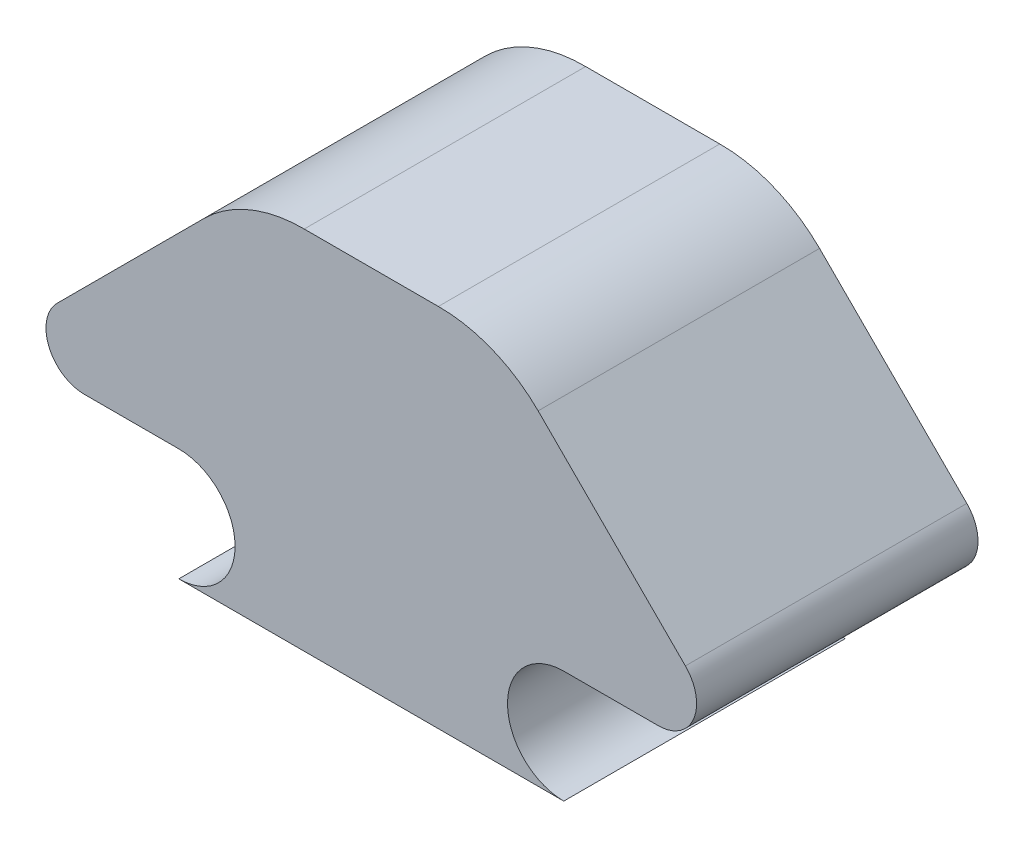
ISO-10303-21;
HEADER;
FILE_DESCRIPTION(('STEP AP214'),'2;1');
FILE_NAME('part.step','',(''),(''),'','','');
FILE_SCHEMA(('AUTOMOTIVE_DESIGN { 1 0 10303 214 1 1 1 1 }'));
ENDSEC;
DATA;
#1=APPLICATION_CONTEXT('core data for automotive mechanical design processes');
#2=APPLICATION_PROTOCOL_DEFINITION('international standard','automotive_design',2000,#1);
#3=PRODUCT_CONTEXT('',#1,'mechanical');
#4=PRODUCT('Part','Part','',(#3));
#5=PRODUCT_RELATED_PRODUCT_CATEGORY('part','',(#4));
#6=PRODUCT_DEFINITION_FORMATION('','',#4);
#7=PRODUCT_DEFINITION_CONTEXT('part definition',#1,'design');
#8=PRODUCT_DEFINITION('design','',#6,#7);
#9=PRODUCT_DEFINITION_SHAPE('','',#8);
#10=(LENGTH_UNIT() NAMED_UNIT(*) SI_UNIT(.MILLI.,.METRE.));
#11=(NAMED_UNIT(*) PLANE_ANGLE_UNIT() SI_UNIT($,.RADIAN.));
#12=(NAMED_UNIT(*) SI_UNIT($,.STERADIAN.) SOLID_ANGLE_UNIT());
#13=UNCERTAINTY_MEASURE_WITH_UNIT(LENGTH_MEASURE(1.E-05),#10,'distance_accuracy_value','');
#14=(GEOMETRIC_REPRESENTATION_CONTEXT(3) GLOBAL_UNCERTAINTY_ASSIGNED_CONTEXT((#13)) GLOBAL_UNIT_ASSIGNED_CONTEXT((#10,
#11,#12)) REPRESENTATION_CONTEXT('',''));
#15=CARTESIAN_POINT('',(0.,0.,0.));
#16=DIRECTION('',(0.,0.,1.));
#17=DIRECTION('',(1.,0.,0.));
#18=AXIS2_PLACEMENT_3D('',#15,#16,#17);
#19=CARTESIAN_POINT('',(0.,0.,-6.35));
#20=DIRECTION('',(0.,-1.,0.));
#21=DIRECTION('',(1.,0.,0.));
#22=AXIS2_PLACEMENT_3D('',#19,#20,#21);
#23=PLANE('',#22);
#24=DIRECTION('',(1.,0.,0.));
#25=VECTOR('',#24,1.);
#26=CARTESIAN_POINT('',(0.,0.,0.));
#27=LINE('',#26,#25);
#28=CARTESIAN_POINT('',(-4.3434,0.,0.));
#29=VERTEX_POINT('',#28);
#30=CARTESIAN_POINT('',(4.3434,0.,0.));
#31=VERTEX_POINT('',#30);
#32=EDGE_CURVE('E161',#29,#31,#27,.T.);
#33=ORIENTED_EDGE('',*,*,#32,.F.);
#34=DIRECTION('',(0.,0.,1.));
#35=VECTOR('',#34,1.);
#36=CARTESIAN_POINT('',(-4.3434,0.,-6.35));
#37=LINE('',#36,#35);
#38=CARTESIAN_POINT('',(-4.3434,0.,-6.35));
#39=VERTEX_POINT('',#38);
#40=EDGE_CURVE('E11',#39,#29,#37,.T.);
#41=ORIENTED_EDGE('',*,*,#40,.F.);
#42=DIRECTION('',(1.,0.,0.));
#43=VECTOR('',#42,1.);
#44=CARTESIAN_POINT('',(0.,0.,-6.35));
#45=LINE('',#44,#43);
#46=CARTESIAN_POINT('',(4.3434,0.,-6.35));
#47=VERTEX_POINT('',#46);
#48=EDGE_CURVE('E137',#39,#47,#45,.T.);
#49=ORIENTED_EDGE('',*,*,#48,.T.);
#50=DIRECTION('',(0.,0.,1.));
#51=VECTOR('',#50,1.);
#52=CARTESIAN_POINT('',(4.3434,0.,-6.35));
#53=LINE('',#52,#51);
#54=EDGE_CURVE('E222',#47,#31,#53,.T.);
#55=ORIENTED_EDGE('',*,*,#54,.T.);
#56=EDGE_LOOP('',(#33,#41,#49,#55));
#57=FACE_BOUND('',#56,.T.);
#58=ADVANCED_FACE('F39',(#57),#23,.T.);
#59=CARTESIAN_POINT('',(-4.3434,1.27,-6.35));
#60=DIRECTION('',(0.,0.,1.));
#61=DIRECTION('',(1.,0.,0.));
#62=AXIS2_PLACEMENT_3D('',#59,#60,#61);
#63=CYLINDRICAL_SURFACE('',#62,1.27);
#64=CARTESIAN_POINT('',(-4.3434,1.27,0.));
#65=DIRECTION('',(0.,0.,-1.));
#66=DIRECTION('',(1.,0.,0.));
#67=AXIS2_PLACEMENT_3D('',#64,#65,#66);
#68=CIRCLE('',#67,1.27);
#69=CARTESIAN_POINT('',(-4.3434,2.54,0.));
#70=VERTEX_POINT('',#69);
#71=EDGE_CURVE('E158',#70,#29,#68,.T.);
#72=ORIENTED_EDGE('',*,*,#71,.F.);
#73=DIRECTION('',(0.,0.,1.));
#74=VECTOR('',#73,1.);
#75=CARTESIAN_POINT('',(-4.3434,2.54,-6.35));
#76=LINE('',#75,#74);
#77=CARTESIAN_POINT('',(-4.3434,2.54,-6.35));
#78=VERTEX_POINT('',#77);
#79=EDGE_CURVE('E50',#78,#70,#76,.T.);
#80=ORIENTED_EDGE('',*,*,#79,.F.);
#81=CARTESIAN_POINT('',(-4.3434,1.27,-6.35));
#82=DIRECTION('',(0.,0.,-1.));
#83=DIRECTION('',(1.,0.,0.));
#84=AXIS2_PLACEMENT_3D('',#81,#82,#83);
#85=CIRCLE('',#84,1.27);
#86=EDGE_CURVE('E123',#78,#39,#85,.T.);
#87=ORIENTED_EDGE('',*,*,#86,.T.);
#88=ORIENTED_EDGE('',*,*,#40,.T.);
#89=EDGE_LOOP('',(#72,#80,#87,#88));
#90=FACE_BOUND('',#89,.T.);
#91=ADVANCED_FACE('F300',(#90),#63,.F.);
#92=CARTESIAN_POINT('',(-4.3434,2.54,-6.35));
#93=DIRECTION('',(0.,-1.,0.));
#94=DIRECTION('',(0.,0.,-1.));
#95=AXIS2_PLACEMENT_3D('',#92,#93,#94);
#96=PLANE('',#95);
#97=DIRECTION('',(1.,0.,0.));
#98=VECTOR('',#97,1.);
#99=CARTESIAN_POINT('',(-4.3434,2.54,0.));
#100=LINE('',#99,#98);
#101=CARTESIAN_POINT('',(-6.477,2.54,0.));
#102=VERTEX_POINT('',#101);
#103=EDGE_CURVE('E106',#102,#70,#100,.T.);
#104=ORIENTED_EDGE('',*,*,#103,.F.);
#105=DIRECTION('',(0.,0.,1.));
#106=VECTOR('',#105,1.);
#107=CARTESIAN_POINT('',(-6.477,2.54,-6.35));
#108=LINE('',#107,#106);
#109=CARTESIAN_POINT('',(-6.477,2.54,-6.35));
#110=VERTEX_POINT('',#109);
#111=EDGE_CURVE('E101',#110,#102,#108,.T.);
#112=ORIENTED_EDGE('',*,*,#111,.F.);
#113=DIRECTION('',(1.,0.,0.));
#114=VECTOR('',#113,1.);
#115=CARTESIAN_POINT('',(-4.3434,2.54,-6.35));
#116=LINE('',#115,#114);
#117=EDGE_CURVE('E104',#110,#78,#116,.T.);
#118=ORIENTED_EDGE('',*,*,#117,.T.);
#119=ORIENTED_EDGE('',*,*,#79,.T.);
#120=EDGE_LOOP('',(#104,#112,#118,#119));
#121=FACE_BOUND('',#120,.T.);
#122=ADVANCED_FACE('F103',(#121),#96,.T.);
#123=CARTESIAN_POINT('',(-6.477,3.4036,-6.35));
#124=DIRECTION('',(0.,0.,1.));
#125=DIRECTION('',(1.,0.,0.));
#126=AXIS2_PLACEMENT_3D('',#123,#124,#125);
#127=CYLINDRICAL_SURFACE('',#126,0.8636);
#128=CARTESIAN_POINT('',(-6.477,3.4036,0.));
#129=DIRECTION('',(0.,0.,1.));
#130=DIRECTION('',(-1.,0.,0.));
#131=AXIS2_PLACEMENT_3D('',#128,#129,#130);
#132=CIRCLE('',#131,0.8636);
#133=CARTESIAN_POINT('',(-7.0876574162327,4.0142574162327,0.));
#134=VERTEX_POINT('',#133);
#135=EDGE_CURVE('E153',#134,#102,#132,.T.);
#136=ORIENTED_EDGE('',*,*,#135,.F.);
#137=DIRECTION('',(0.,0.,1.));
#138=VECTOR('',#137,1.);
#139=CARTESIAN_POINT('',(-7.0876574162327,4.0142574162327,-6.35));
#140=LINE('',#139,#138);
#141=CARTESIAN_POINT('',(-7.0876574162327,4.0142574162327,-6.35));
#142=VERTEX_POINT('',#141);
#143=EDGE_CURVE('E112',#142,#134,#140,.T.);
#144=ORIENTED_EDGE('',*,*,#143,.F.);
#145=CARTESIAN_POINT('',(-6.477,3.4036,-6.35));
#146=DIRECTION('',(0.,0.,1.));
#147=DIRECTION('',(-1.,0.,0.));
#148=AXIS2_PLACEMENT_3D('',#145,#146,#147);
#149=CIRCLE('',#148,0.8636);
#150=EDGE_CURVE('E120',#142,#110,#149,.T.);
#151=ORIENTED_EDGE('',*,*,#150,.T.);
#152=ORIENTED_EDGE('',*,*,#111,.T.);
#153=EDGE_LOOP('',(#136,#144,#151,#152));
#154=FACE_BOUND('',#153,.T.);
#155=ADVANCED_FACE('F126',(#154),#127,.T.);
#156=CARTESIAN_POINT('',(-7.0876574162327,4.0142574162327,-6.35));
#157=DIRECTION('',(-0.707106781186547,0.707106781186548,0.));
#158=DIRECTION('',(-0.707106781186548,-0.707106781186547,0.));
#159=AXIS2_PLACEMENT_3D('',#156,#157,#158);
#160=PLANE('',#159);
#161=DIRECTION('',(-0.707106781186548,-0.707106781186548,0.));
#162=VECTOR('',#161,1.);
#163=CARTESIAN_POINT('',(-7.0876574162327,4.0142574162327,0.));
#164=LINE('',#163,#162);
#165=CARTESIAN_POINT('',(-3.76496265143711,7.33695218102829,0.));
#166=VERTEX_POINT('',#165);
#167=EDGE_CURVE('E149',#166,#134,#164,.T.);
#168=ORIENTED_EDGE('',*,*,#167,.F.);
#169=DIRECTION('',(0.,0.,1.));
#170=VECTOR('',#169,1.);
#171=CARTESIAN_POINT('',(-3.76496265143711,7.33695218102829,-6.35));
#172=LINE('',#171,#170);
#173=CARTESIAN_POINT('',(-3.76496265143711,7.33695218102829,-6.35));
#174=VERTEX_POINT('',#173);
#175=EDGE_CURVE('E169',#174,#166,#172,.T.);
#176=ORIENTED_EDGE('',*,*,#175,.F.);
#177=DIRECTION('',(-0.707106781186548,-0.707106781186548,0.));
#178=VECTOR('',#177,1.);
#179=CARTESIAN_POINT('',(-7.0876574162327,4.0142574162327,-6.35));
#180=LINE('',#179,#178);
#181=EDGE_CURVE('E128',#174,#142,#180,.T.);
#182=ORIENTED_EDGE('',*,*,#181,.T.);
#183=ORIENTED_EDGE('',*,*,#143,.T.);
#184=EDGE_LOOP('',(#168,#176,#182,#183));
#185=FACE_BOUND('',#184,.T.);
#186=ADVANCED_FACE('F231',(#185),#160,.T.);
#187=CARTESIAN_POINT('',(-1.53562511408408,5.07627105699759,-6.35));
#188=DIRECTION('',(0.,0.,1.));
#189=DIRECTION('',(1.,0.,0.));
#190=AXIS2_PLACEMENT_3D('',#187,#188,#189);
#191=CYLINDRICAL_SURFACE('',#190,3.175);
#192=CARTESIAN_POINT('',(-1.53562511408408,5.07627105699759,0.));
#193=DIRECTION('',(0.,0.,1.));
#194=DIRECTION('',(-1.,0.,0.));
#195=AXIS2_PLACEMENT_3D('',#192,#193,#194);
#196=CIRCLE('',#195,3.175);
#197=CARTESIAN_POINT('',(-1.51346185139758,8.25119370011617,0.));
#198=VERTEX_POINT('',#197);
#199=EDGE_CURVE('E144',#198,#166,#196,.T.);
#200=ORIENTED_EDGE('',*,*,#199,.F.);
#201=DIRECTION('',(0.,0.,1.));
#202=VECTOR('',#201,1.);
#203=CARTESIAN_POINT('',(-1.51346185139758,8.25119370011617,-6.35));
#204=LINE('',#203,#202);
#205=CARTESIAN_POINT('',(-1.51346185139758,8.25119370011617,-6.35));
#206=VERTEX_POINT('',#205);
#207=EDGE_CURVE('E43',#206,#198,#204,.T.);
#208=ORIENTED_EDGE('',*,*,#207,.F.);
#209=CARTESIAN_POINT('',(-1.53562511408408,5.07627105699759,-6.35));
#210=DIRECTION('',(0.,0.,1.));
#211=DIRECTION('',(-1.,0.,0.));
#212=AXIS2_PLACEMENT_3D('',#209,#210,#211);
#213=CIRCLE('',#212,3.175);
#214=EDGE_CURVE('E131',#206,#174,#213,.T.);
#215=ORIENTED_EDGE('',*,*,#214,.T.);
#216=ORIENTED_EDGE('',*,*,#175,.T.);
#217=EDGE_LOOP('',(#200,#208,#215,#216));
#218=FACE_BOUND('',#217,.T.);
#219=ADVANCED_FACE('F178',(#218),#191,.T.);
#220=CARTESIAN_POINT('',(-1.51346185139758,8.25119370011617,-6.35));
#221=DIRECTION('',(0.,1.,0.));
#222=DIRECTION('',(0.,0.,1.));
#223=AXIS2_PLACEMENT_3D('',#220,#221,#222);
#224=PLANE('',#223);
#225=DIRECTION('',(-1.,0.,0.));
#226=VECTOR('',#225,1.);
#227=CARTESIAN_POINT('',(-1.51346185139758,8.25119370011617,0.));
#228=LINE('',#227,#226);
#229=CARTESIAN_POINT('',(1.51346185139758,8.25119370011617,0.));
#230=VERTEX_POINT('',#229);
#231=EDGE_CURVE('E140',#230,#198,#228,.T.);
#232=ORIENTED_EDGE('',*,*,#231,.F.);
#233=DIRECTION('',(0.,0.,1.));
#234=VECTOR('',#233,1.);
#235=CARTESIAN_POINT('',(1.51346185139758,8.25119370011617,-6.35));
#236=LINE('',#235,#234);
#237=CARTESIAN_POINT('',(1.51346185139758,8.25119370011617,-6.35));
#238=VERTEX_POINT('',#237);
#239=EDGE_CURVE('E145',#238,#230,#236,.T.);
#240=ORIENTED_EDGE('',*,*,#239,.F.);
#241=DIRECTION('',(-1.,0.,0.));
#242=VECTOR('',#241,1.);
#243=CARTESIAN_POINT('',(-1.51346185139758,8.25119370011617,-6.35));
#244=LINE('',#243,#242);
#245=EDGE_CURVE('E164',#238,#206,#244,.T.);
#246=ORIENTED_EDGE('',*,*,#245,.T.);
#247=ORIENTED_EDGE('',*,*,#207,.T.);
#248=EDGE_LOOP('',(#232,#240,#246,#247));
#249=FACE_BOUND('',#248,.T.);
#250=ADVANCED_FACE('F41',(#249),#224,.T.);
#251=CARTESIAN_POINT('',(-4.3434,1.27,-6.35));
#252=DIRECTION('',(0.,0.,1.));
#253=DIRECTION('',(1.,0.,0.));
#254=AXIS2_PLACEMENT_3D('',#251,#252,#253);
#255=PLANE('',#254);
#256=ORIENTED_EDGE('',*,*,#245,.F.);
#257=CARTESIAN_POINT('',(1.53562511408408,5.07627105699759,-6.35));
#258=DIRECTION('',(0.,0.,-1.));
#259=DIRECTION('',(1.,0.,0.));
#260=AXIS2_PLACEMENT_3D('',#257,#258,#259);
#261=CIRCLE('',#260,3.175);
#262=CARTESIAN_POINT('',(3.76496265143711,7.33695218102829,-6.35));
#263=VERTEX_POINT('',#262);
#264=EDGE_CURVE('E226',#238,#263,#261,.T.);
#265=ORIENTED_EDGE('',*,*,#264,.T.);
#266=DIRECTION('',(0.707106781186548,-0.707106781186548,0.));
#267=VECTOR('',#266,1.);
#268=CARTESIAN_POINT('',(7.0876574162327,4.0142574162327,-6.35));
#269=LINE('',#268,#267);
#270=CARTESIAN_POINT('',(7.0876574162327,4.0142574162327,-6.35));
#271=VERTEX_POINT('',#270);
#272=EDGE_CURVE('E281',#263,#271,#269,.T.);
#273=ORIENTED_EDGE('',*,*,#272,.T.);
#274=CARTESIAN_POINT('',(6.477,3.4036,-6.35));
#275=DIRECTION('',(0.,0.,-1.));
#276=DIRECTION('',(1.,0.,0.));
#277=AXIS2_PLACEMENT_3D('',#274,#275,#276);
#278=CIRCLE('',#277,0.8636);
#279=CARTESIAN_POINT('',(6.477,2.54,-6.35));
#280=VERTEX_POINT('',#279);
#281=EDGE_CURVE('E270',#271,#280,#278,.T.);
#282=ORIENTED_EDGE('',*,*,#281,.T.);
#283=DIRECTION('',(-1.,0.,0.));
#284=VECTOR('',#283,1.);
#285=CARTESIAN_POINT('',(4.3434,2.54,-6.35));
#286=LINE('',#285,#284);
#287=CARTESIAN_POINT('',(4.3434,2.54,-6.35));
#288=VERTEX_POINT('',#287);
#289=EDGE_CURVE('E199',#280,#288,#286,.T.);
#290=ORIENTED_EDGE('',*,*,#289,.T.);
#291=CARTESIAN_POINT('',(4.3434,1.27,-6.35));
#292=DIRECTION('',(0.,0.,1.));
#293=DIRECTION('',(-1.,0.,0.));
#294=AXIS2_PLACEMENT_3D('',#291,#292,#293);
#295=CIRCLE('',#294,1.27);
#296=EDGE_CURVE('E194',#288,#47,#295,.T.);
#297=ORIENTED_EDGE('',*,*,#296,.T.);
#298=ORIENTED_EDGE('',*,*,#48,.F.);
#299=ORIENTED_EDGE('',*,*,#86,.F.);
#300=ORIENTED_EDGE('',*,*,#117,.F.);
#301=ORIENTED_EDGE('',*,*,#150,.F.);
#302=ORIENTED_EDGE('',*,*,#181,.F.);
#303=ORIENTED_EDGE('',*,*,#214,.F.);
#304=EDGE_LOOP('',(#256,#265,#273,#282,#290,#297,#298,#299,#300,#301,#302,#303));
#305=FACE_BOUND('',#304,.T.);
#306=ADVANCED_FACE('F118',(#305),#255,.F.);
#307=CARTESIAN_POINT('',(-4.3434,1.27,0.));
#308=DIRECTION('',(0.,0.,1.));
#309=DIRECTION('',(1.,0.,0.));
#310=AXIS2_PLACEMENT_3D('',#307,#308,#309);
#311=PLANE('',#310);
#312=ORIENTED_EDGE('',*,*,#32,.T.);
#313=CARTESIAN_POINT('',(4.3434,1.27,0.));
#314=DIRECTION('',(0.,0.,1.));
#315=DIRECTION('',(-1.,0.,0.));
#316=AXIS2_PLACEMENT_3D('',#313,#314,#315);
#317=CIRCLE('',#316,1.27);
#318=CARTESIAN_POINT('',(4.3434,2.54,0.));
#319=VERTEX_POINT('',#318);
#320=EDGE_CURVE('E242',#319,#31,#317,.T.);
#321=ORIENTED_EDGE('',*,*,#320,.F.);
#322=DIRECTION('',(-1.,0.,0.));
#323=VECTOR('',#322,1.);
#324=CARTESIAN_POINT('',(4.3434,2.54,0.));
#325=LINE('',#324,#323);
#326=CARTESIAN_POINT('',(6.477,2.54,0.));
#327=VERTEX_POINT('',#326);
#328=EDGE_CURVE('E272',#327,#319,#325,.T.);
#329=ORIENTED_EDGE('',*,*,#328,.F.);
#330=CARTESIAN_POINT('',(6.477,3.4036,0.));
#331=DIRECTION('',(0.,0.,-1.));
#332=DIRECTION('',(1.,0.,0.));
#333=AXIS2_PLACEMENT_3D('',#330,#331,#332);
#334=CIRCLE('',#333,0.8636);
#335=CARTESIAN_POINT('',(7.0876574162327,4.0142574162327,0.));
#336=VERTEX_POINT('',#335);
#337=EDGE_CURVE('E201',#336,#327,#334,.T.);
#338=ORIENTED_EDGE('',*,*,#337,.F.);
#339=DIRECTION('',(0.707106781186548,-0.707106781186548,0.));
#340=VECTOR('',#339,1.);
#341=CARTESIAN_POINT('',(7.0876574162327,4.0142574162327,0.));
#342=LINE('',#341,#340);
#343=CARTESIAN_POINT('',(3.76496265143711,7.33695218102829,0.));
#344=VERTEX_POINT('',#343);
#345=EDGE_CURVE('E188',#344,#336,#342,.T.);
#346=ORIENTED_EDGE('',*,*,#345,.F.);
#347=CARTESIAN_POINT('',(1.53562511408408,5.07627105699759,0.));
#348=DIRECTION('',(0.,0.,-1.));
#349=DIRECTION('',(1.,0.,0.));
#350=AXIS2_PLACEMENT_3D('',#347,#348,#349);
#351=CIRCLE('',#350,3.175);
#352=EDGE_CURVE('E184',#230,#344,#351,.T.);
#353=ORIENTED_EDGE('',*,*,#352,.F.);
#354=ORIENTED_EDGE('',*,*,#231,.T.);
#355=ORIENTED_EDGE('',*,*,#199,.T.);
#356=ORIENTED_EDGE('',*,*,#167,.T.);
#357=ORIENTED_EDGE('',*,*,#135,.T.);
#358=ORIENTED_EDGE('',*,*,#103,.T.);
#359=ORIENTED_EDGE('',*,*,#71,.T.);
#360=EDGE_LOOP('',(#312,#321,#329,#338,#346,#353,#354,#355,#356,#357,#358,#359));
#361=FACE_BOUND('',#360,.T.);
#362=ADVANCED_FACE('F181',(#361),#311,.T.);
#363=CARTESIAN_POINT('',(1.53562511408408,5.07627105699759,-6.35));
#364=DIRECTION('',(0.,0.,1.));
#365=DIRECTION('',(1.,0.,0.));
#366=AXIS2_PLACEMENT_3D('',#363,#364,#365);
#367=CYLINDRICAL_SURFACE('',#366,3.175);
#368=ORIENTED_EDGE('',*,*,#352,.T.);
#369=DIRECTION('',(0.,0.,1.));
#370=VECTOR('',#369,1.);
#371=CARTESIAN_POINT('',(3.76496265143711,7.33695218102829,-6.35));
#372=LINE('',#371,#370);
#373=EDGE_CURVE('E207',#263,#344,#372,.T.);
#374=ORIENTED_EDGE('',*,*,#373,.F.);
#375=ORIENTED_EDGE('',*,*,#264,.F.);
#376=ORIENTED_EDGE('',*,*,#239,.T.);
#377=EDGE_LOOP('',(#368,#374,#375,#376));
#378=FACE_BOUND('',#377,.T.);
#379=ADVANCED_FACE('F324',(#378),#367,.T.);
#380=CARTESIAN_POINT('',(7.0876574162327,4.0142574162327,-6.35));
#381=DIRECTION('',(-0.707106781186547,-0.707106781186548,0.));
#382=DIRECTION('',(0.707106781186548,-0.707106781186547,0.));
#383=AXIS2_PLACEMENT_3D('',#380,#381,#382);
#384=PLANE('',#383);
#385=ORIENTED_EDGE('',*,*,#345,.T.);
#386=DIRECTION('',(0.,0.,1.));
#387=VECTOR('',#386,1.);
#388=CARTESIAN_POINT('',(7.0876574162327,4.0142574162327,-6.35));
#389=LINE('',#388,#387);
#390=EDGE_CURVE('E210',#271,#336,#389,.T.);
#391=ORIENTED_EDGE('',*,*,#390,.F.);
#392=ORIENTED_EDGE('',*,*,#272,.F.);
#393=ORIENTED_EDGE('',*,*,#373,.T.);
#394=EDGE_LOOP('',(#385,#391,#392,#393));
#395=FACE_BOUND('',#394,.T.);
#396=ADVANCED_FACE('F264',(#395),#384,.F.);
#397=CARTESIAN_POINT('',(6.477,3.4036,-6.35));
#398=DIRECTION('',(0.,0.,1.));
#399=DIRECTION('',(1.,0.,0.));
#400=AXIS2_PLACEMENT_3D('',#397,#398,#399);
#401=CYLINDRICAL_SURFACE('',#400,0.8636);
#402=ORIENTED_EDGE('',*,*,#337,.T.);
#403=DIRECTION('',(0.,0.,1.));
#404=VECTOR('',#403,1.);
#405=CARTESIAN_POINT('',(6.477,2.54,-6.35));
#406=LINE('',#405,#404);
#407=EDGE_CURVE('E214',#280,#327,#406,.T.);
#408=ORIENTED_EDGE('',*,*,#407,.F.);
#409=ORIENTED_EDGE('',*,*,#281,.F.);
#410=ORIENTED_EDGE('',*,*,#390,.T.);
#411=EDGE_LOOP('',(#402,#408,#409,#410));
#412=FACE_BOUND('',#411,.T.);
#413=ADVANCED_FACE('F268',(#412),#401,.T.);
#414=CARTESIAN_POINT('',(4.3434,2.54,-6.35));
#415=DIRECTION('',(0.,1.,0.));
#416=DIRECTION('',(0.,0.,1.));
#417=AXIS2_PLACEMENT_3D('',#414,#415,#416);
#418=PLANE('',#417);
#419=ORIENTED_EDGE('',*,*,#328,.T.);
#420=DIRECTION('',(0.,0.,1.));
#421=VECTOR('',#420,1.);
#422=CARTESIAN_POINT('',(4.3434,2.54,-6.35));
#423=LINE('',#422,#421);
#424=EDGE_CURVE('E218',#288,#319,#423,.T.);
#425=ORIENTED_EDGE('',*,*,#424,.F.);
#426=ORIENTED_EDGE('',*,*,#289,.F.);
#427=ORIENTED_EDGE('',*,*,#407,.T.);
#428=EDGE_LOOP('',(#419,#425,#426,#427));
#429=FACE_BOUND('',#428,.T.);
#430=ADVANCED_FACE('F290',(#429),#418,.F.);
#431=CARTESIAN_POINT('',(4.3434,1.27,-6.35));
#432=DIRECTION('',(0.,0.,1.));
#433=DIRECTION('',(1.,0.,0.));
#434=AXIS2_PLACEMENT_3D('',#431,#432,#433);
#435=CYLINDRICAL_SURFACE('',#434,1.27);
#436=ORIENTED_EDGE('',*,*,#320,.T.);
#437=ORIENTED_EDGE('',*,*,#54,.F.);
#438=ORIENTED_EDGE('',*,*,#296,.F.);
#439=ORIENTED_EDGE('',*,*,#424,.T.);
#440=EDGE_LOOP('',(#436,#437,#438,#439));
#441=FACE_BOUND('',#440,.T.);
#442=ADVANCED_FACE('F240',(#441),#435,.F.);
#443=CLOSED_SHELL('',(#58,#91,#122,#155,#186,#219,#250,#306,#362,#379,#396,#413,#430,#442));
#444=MANIFOLD_SOLID_BREP('B2',#443);
#445=ADVANCED_BREP_SHAPE_REPRESENTATION('',(#18,#444),#14);
#446=SHAPE_DEFINITION_REPRESENTATION(#9,#445);
ENDSEC;
END-ISO-10303-21;
